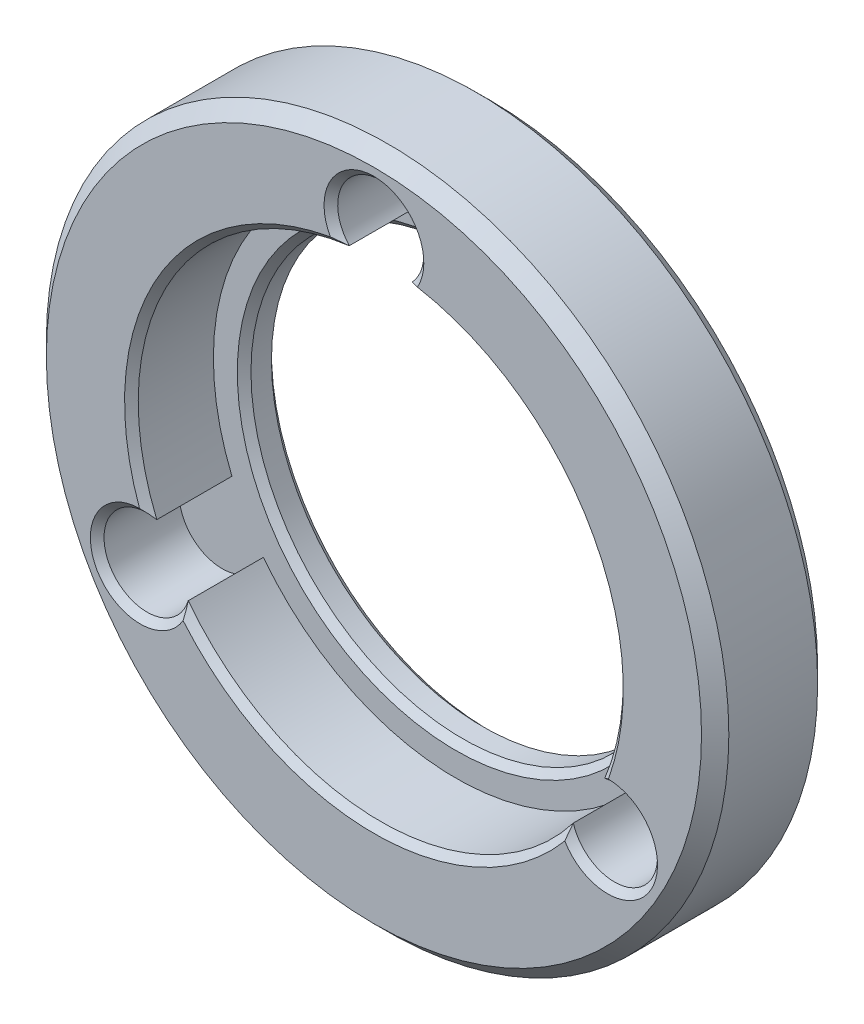
ISO-10303-21;
HEADER;
FILE_DESCRIPTION(('STEP AP214'),'2;1');
FILE_NAME('part.step','',(''),(''),'','','');
FILE_SCHEMA(('AUTOMOTIVE_DESIGN { 1 0 10303 214 1 1 1 1 }'));
ENDSEC;
DATA;
#1=APPLICATION_CONTEXT('core data for automotive mechanical design processes');
#2=APPLICATION_PROTOCOL_DEFINITION('international standard','automotive_design',2000,#1);
#3=PRODUCT_CONTEXT('',#1,'mechanical');
#4=PRODUCT('Part','Part','',(#3));
#5=PRODUCT_RELATED_PRODUCT_CATEGORY('part','',(#4));
#6=PRODUCT_DEFINITION_FORMATION('','',#4);
#7=PRODUCT_DEFINITION_CONTEXT('part definition',#1,'design');
#8=PRODUCT_DEFINITION('design','',#6,#7);
#9=PRODUCT_DEFINITION_SHAPE('','',#8);
#10=(LENGTH_UNIT() NAMED_UNIT(*) SI_UNIT(.MILLI.,.METRE.));
#11=(NAMED_UNIT(*) PLANE_ANGLE_UNIT() SI_UNIT($,.RADIAN.));
#12=(NAMED_UNIT(*) SI_UNIT($,.STERADIAN.) SOLID_ANGLE_UNIT());
#13=UNCERTAINTY_MEASURE_WITH_UNIT(LENGTH_MEASURE(1.E-05),#10,'distance_accuracy_value','');
#14=(GEOMETRIC_REPRESENTATION_CONTEXT(3) GLOBAL_UNCERTAINTY_ASSIGNED_CONTEXT((#13)) GLOBAL_UNIT_ASSIGNED_CONTEXT((#10,
#11,#12)) REPRESENTATION_CONTEXT('',''));
#15=CARTESIAN_POINT('',(0.,0.,0.));
#16=DIRECTION('',(0.,0.,1.));
#17=DIRECTION('',(1.,0.,0.));
#18=AXIS2_PLACEMENT_3D('',#15,#16,#17);
#19=CARTESIAN_POINT('',(-61.57257075142,7.13704868235254,27.7075634239852));
#20=DIRECTION('',(0.,0.,1.));
#21=DIRECTION('',(1.,0.,0.));
#22=AXIS2_PLACEMENT_3D('',#19,#20,#21);
#23=CYLINDRICAL_SURFACE('',#22,4.5085);
#24=DIRECTION('',(0.,0.,1.));
#25=VECTOR('',#24,1.);
#26=CARTESIAN_POINT('',(-65.1516811756143,4.39541763105786,28.4695634239852));
#27=LINE('',#26,#25);
#28=CARTESIAN_POINT('',(-65.1516811756143,4.39541763105786,27.7075634239852));
#29=VERTEX_POINT('',#28);
#30=CARTESIAN_POINT('',(-65.1516811756143,4.39541763105786,29.1045634239852));
#31=VERTEX_POINT('',#30);
#32=EDGE_CURVE('E100',#29,#31,#27,.T.);
#33=ORIENTED_EDGE('',*,*,#32,.T.);
#34=CARTESIAN_POINT('',(-61.57257075142,7.13704868235254,29.1045634239852));
#35=DIRECTION('',(0.,0.,1.));
#36=DIRECTION('',(1.,0.,0.));
#37=AXIS2_PLACEMENT_3D('',#34,#35,#36);
#38=CIRCLE('',#37,4.5085);
#39=CARTESIAN_POINT('',(-57.9934603272255,4.39541763105795,29.1045634239852));
#40=VERTEX_POINT('',#39);
#41=EDGE_CURVE('E149',#31,#40,#38,.T.);
#42=ORIENTED_EDGE('',*,*,#41,.T.);
#43=DIRECTION('',(0.,0.,1.));
#44=VECTOR('',#43,1.);
#45=CARTESIAN_POINT('',(-57.9934603272255,4.39541763105795,28.4695634239852));
#46=LINE('',#45,#44);
#47=CARTESIAN_POINT('',(-57.9934603272255,4.39541763105795,27.7075634239852));
#48=VERTEX_POINT('',#47);
#49=EDGE_CURVE('E140',#40,#48,#46,.F.);
#50=ORIENTED_EDGE('',*,*,#49,.T.);
#51=CARTESIAN_POINT('',(-61.57257075142,7.13704868235254,27.7075634239852));
#52=DIRECTION('',(0.,0.,1.));
#53=DIRECTION('',(1.,0.,0.));
#54=AXIS2_PLACEMENT_3D('',#51,#52,#53);
#55=CIRCLE('',#54,4.5085);
#56=EDGE_CURVE('E116',#29,#48,#55,.T.);
#57=ORIENTED_EDGE('',*,*,#56,.F.);
#58=EDGE_LOOP('',(#33,#42,#50,#57));
#59=FACE_BOUND('',#58,.T.);
#60=ADVANCED_FACE('F15',(#59),#23,.F.);
#61=DIRECTION('',(0.,0.,1.));
#62=VECTOR('',#61,1.);
#63=CARTESIAN_POINT('',(-57.4086934010974,5.40826365769772,28.4695634239852));
#64=LINE('',#63,#62);
#65=CARTESIAN_POINT('',(-57.4086934010974,5.40826365769772,27.7075634239852));
#66=VERTEX_POINT('',#65);
#67=CARTESIAN_POINT('',(-57.4086934010974,5.40826365769772,29.1045634239852));
#68=VERTEX_POINT('',#67);
#69=EDGE_CURVE('E136',#66,#68,#64,.T.);
#70=ORIENTED_EDGE('',*,*,#69,.T.);
#71=CARTESIAN_POINT('',(-61.57257075142,7.13704868235254,29.1045634239852));
#72=DIRECTION('',(0.,0.,1.));
#73=DIRECTION('',(1.,0.,0.));
#74=AXIS2_PLACEMENT_3D('',#71,#72,#73);
#75=CIRCLE('',#74,4.5085);
#76=CARTESIAN_POINT('',(-60.9878038252917,11.6074647583019,29.1045634239852));
#77=VERTEX_POINT('',#76);
#78=EDGE_CURVE('E274',#68,#77,#75,.T.);
#79=ORIENTED_EDGE('',*,*,#78,.T.);
#80=DIRECTION('',(0.,0.,1.));
#81=VECTOR('',#80,1.);
#82=CARTESIAN_POINT('',(-60.9878038252917,11.6074647583019,28.4695634239852));
#83=LINE('',#82,#81);
#84=CARTESIAN_POINT('',(-60.9878038252917,11.6074647583019,27.7075634239852));
#85=VERTEX_POINT('',#84);
#86=EDGE_CURVE('E130',#77,#85,#83,.F.);
#87=ORIENTED_EDGE('',*,*,#86,.T.);
#88=EDGE_CURVE('E118',#66,#85,#55,.T.);
#89=ORIENTED_EDGE('',*,*,#88,.F.);
#90=EDGE_LOOP('',(#70,#79,#87,#89));
#91=FACE_BOUND('',#90,.T.);
#92=ADVANCED_FACE('F207',(#91),#23,.F.);
#93=CARTESIAN_POINT('',(-61.57257075142,7.13704868235254,29.2315634239852));
#94=DIRECTION('',(0.,0.,-1.));
#95=DIRECTION('',(-1.,0.,0.));
#96=AXIS2_PLACEMENT_3D('',#93,#94,#95);
#97=CYLINDRICAL_SURFACE('',#96,3.937);
#98=CARTESIAN_POINT('',(-61.57257075142,7.13704868235254,27.5805634239852));
#99=DIRECTION('',(0.,0.,1.));
#100=DIRECTION('',(1.,0.,0.));
#101=AXIS2_PLACEMENT_3D('',#98,#99,#100);
#102=CIRCLE('',#101,3.937);
#103=CARTESIAN_POINT('',(-57.63557075142,7.13704868235254,27.5805634239852));
#104=VERTEX_POINT('',#103);
#105=EDGE_CURVE('E303',#104,#104,#102,.T.);
#106=ORIENTED_EDGE('',*,*,#105,.T.);
#107=EDGE_LOOP('',(#106));
#108=FACE_BOUND('',#107,.T.);
#109=CARTESIAN_POINT('',(-61.57257075142,7.13704868235254,27.1995634239852));
#110=DIRECTION('',(0.,0.,1.));
#111=DIRECTION('',(1.,0.,0.));
#112=AXIS2_PLACEMENT_3D('',#109,#110,#111);
#113=CIRCLE('',#112,3.937);
#114=CARTESIAN_POINT('',(-57.63557075142,7.13704868235254,27.1995634239852));
#115=VERTEX_POINT('',#114);
#116=EDGE_CURVE('E299',#115,#115,#113,.F.);
#117=ORIENTED_EDGE('',*,*,#116,.T.);
#118=EDGE_LOOP('',(#117));
#119=FACE_BOUND('',#118,.T.);
#120=ADVANCED_FACE('F211',(#108,#119),#97,.F.);
#121=CARTESIAN_POINT('',(-61.57257075142,7.13704868235254,29.2315634239852));
#122=DIRECTION('',(0.,0.,1.));
#123=DIRECTION('',(1.,0.,0.));
#124=AXIS2_PLACEMENT_3D('',#121,#122,#123);
#125=PLANE('',#124);
#126=CARTESIAN_POINT('',(-61.57257075142,7.13704868235254,29.2315634239852));
#127=DIRECTION('',(0.,0.,1.));
#128=DIRECTION('',(1.,0.,0.));
#129=AXIS2_PLACEMENT_3D('',#126,#127,#128);
#130=CIRCLE('',#129,4.63550000000001);
#131=CARTESIAN_POINT('',(-65.9300395524616,5.55580679764658,29.2315634239852));
#132=VERTEX_POINT('',#131);
#133=CARTESIAN_POINT('',(-62.3819095102576,11.7013483026057,29.2315634239852));
#134=VERTEX_POINT('',#133);
#135=EDGE_CURVE('E335',#132,#134,#130,.F.);
#136=ORIENTED_EDGE('',*,*,#135,.T.);
#137=CARTESIAN_POINT('',(-61.57257075142,12.1535486823525,29.2315634239852));
#138=DIRECTION('',(0.,0.,1.));
#139=DIRECTION('',(1.,0.,0.));
#140=AXIS2_PLACEMENT_3D('',#137,#138,#139);
#141=CIRCLE('',#140,0.927100000000008);
#142=CARTESIAN_POINT('',(-60.7632319925823,11.7013483026057,29.2315634239852));
#143=VERTEX_POINT('',#142);
#144=EDGE_CURVE('E284',#134,#143,#141,.F.);
#145=ORIENTED_EDGE('',*,*,#144,.T.);
#146=CARTESIAN_POINT('',(-61.57257075142,7.13704868235254,29.2315634239852));
#147=DIRECTION('',(0.,0.,1.));
#148=DIRECTION('',(1.,0.,0.));
#149=AXIS2_PLACEMENT_3D('',#146,#147,#148);
#150=CIRCLE('',#149,4.63550000000001);
#151=CARTESIAN_POINT('',(-57.2151019503783,5.55580679764663,29.2315634239852));
#152=VERTEX_POINT('',#151);
#153=EDGE_CURVE('E272',#143,#152,#150,.F.);
#154=ORIENTED_EDGE('',*,*,#153,.T.);
#155=CARTESIAN_POINT('',(-57.2281543133352,4.62879868235246,29.2315634239852));
#156=DIRECTION('',(0.,0.,1.));
#157=DIRECTION('',(1.,0.,0.));
#158=AXIS2_PLACEMENT_3D('',#155,#156,#157);
#159=CIRCLE('',#158,0.927100000000008);
#160=CARTESIAN_POINT('',(-58.0244407092158,4.15399094680524,29.2315634239852));
#161=VERTEX_POINT('',#160);
#162=EDGE_CURVE('E277',#152,#161,#159,.F.);
#163=ORIENTED_EDGE('',*,*,#162,.T.);
#164=CARTESIAN_POINT('',(-61.57257075142,7.13704868235254,29.2315634239852));
#165=DIRECTION('',(0.,0.,1.));
#166=DIRECTION('',(1.,0.,0.));
#167=AXIS2_PLACEMENT_3D('',#164,#165,#166);
#168=CIRCLE('',#167,4.63550000000001);
#169=CARTESIAN_POINT('',(-65.120700793624,4.15399094680517,29.2315634239852));
#170=VERTEX_POINT('',#169);
#171=EDGE_CURVE('E280',#161,#170,#168,.F.);
#172=ORIENTED_EDGE('',*,*,#171,.T.);
#173=CARTESIAN_POINT('',(-65.9169871895046,4.62879868235241,29.2315634239852));
#174=DIRECTION('',(0.,0.,1.));
#175=DIRECTION('',(1.,0.,0.));
#176=AXIS2_PLACEMENT_3D('',#173,#174,#175);
#177=CIRCLE('',#176,0.927100000000005);
#178=EDGE_CURVE('E168',#170,#132,#177,.F.);
#179=ORIENTED_EDGE('',*,*,#178,.T.);
#180=EDGE_LOOP('',(#136,#145,#154,#163,#172,#179));
#181=FACE_BOUND('',#180,.T.);
#182=CARTESIAN_POINT('',(-61.57257075142,7.13704868235254,29.2315634239852));
#183=DIRECTION('',(0.,0.,1.));
#184=DIRECTION('',(1.,0.,0.));
#185=AXIS2_PLACEMENT_3D('',#182,#183,#184);
#186=CIRCLE('',#185,6.08965);
#187=CARTESIAN_POINT('',(-55.48292075142,7.13704868235254,29.2315634239852));
#188=VERTEX_POINT('',#187);
#189=EDGE_CURVE('E323',#188,#188,#186,.T.);
#190=ORIENTED_EDGE('',*,*,#189,.T.);
#191=EDGE_LOOP('',(#190));
#192=FACE_BOUND('',#191,.T.);
#193=ADVANCED_FACE('F227',(#181,#192),#125,.T.);
#194=CARTESIAN_POINT('',(-61.57257075142,7.13704868235254,27.0725634239852));
#195=DIRECTION('',(0.,0.,1.));
#196=DIRECTION('',(1.,0.,0.));
#197=AXIS2_PLACEMENT_3D('',#194,#195,#196);
#198=PLANE('',#197);
#199=CARTESIAN_POINT('',(-61.57257075142,7.13704868235254,27.0725634239852));
#200=DIRECTION('',(0.,0.,1.));
#201=DIRECTION('',(1.,0.,0.));
#202=AXIS2_PLACEMENT_3D('',#199,#200,#201);
#203=CIRCLE('',#202,4.064);
#204=CARTESIAN_POINT('',(-57.50857075142,7.13704868235254,27.0725634239852));
#205=VERTEX_POINT('',#204);
#206=EDGE_CURVE('E10',#205,#205,#203,.T.);
#207=ORIENTED_EDGE('',*,*,#206,.T.);
#208=EDGE_LOOP('',(#207));
#209=FACE_BOUND('',#208,.T.);
#210=CARTESIAN_POINT('',(-61.57257075142,7.13704868235254,27.0725634239852));
#211=DIRECTION('',(0.,0.,1.));
#212=DIRECTION('',(1.,0.,0.));
#213=AXIS2_PLACEMENT_3D('',#210,#211,#212);
#214=CIRCLE('',#213,6.08965);
#215=CARTESIAN_POINT('',(-55.48292075142,7.13704868235254,27.0725634239852));
#216=VERTEX_POINT('',#215);
#217=EDGE_CURVE('E321',#216,#216,#214,.F.);
#218=ORIENTED_EDGE('',*,*,#217,.T.);
#219=EDGE_LOOP('',(#218));
#220=FACE_BOUND('',#219,.T.);
#221=ADVANCED_FACE('F222',(#209,#220),#198,.F.);
#222=CARTESIAN_POINT('',(-61.57257075142,7.13704868235254,29.2315634239852));
#223=DIRECTION('',(0.,0.,-1.));
#224=DIRECTION('',(-1.,0.,0.));
#225=AXIS2_PLACEMENT_3D('',#222,#223,#224);
#226=CYLINDRICAL_SURFACE('',#225,6.34365);
#227=CARTESIAN_POINT('',(-61.57257075142,7.13704868235254,27.3265634239852));
#228=DIRECTION('',(0.,0.,1.));
#229=DIRECTION('',(1.,0.,0.));
#230=AXIS2_PLACEMENT_3D('',#227,#228,#229);
#231=CIRCLE('',#230,6.34365);
#232=CARTESIAN_POINT('',(-55.22892075142,7.13704868235254,27.3265634239852));
#233=VERTEX_POINT('',#232);
#234=EDGE_CURVE('E123',#233,#233,#231,.T.);
#235=ORIENTED_EDGE('',*,*,#234,.T.);
#236=EDGE_LOOP('',(#235));
#237=FACE_BOUND('',#236,.T.);
#238=CARTESIAN_POINT('',(-61.57257075142,7.13704868235254,28.9775634239852));
#239=DIRECTION('',(0.,0.,1.));
#240=DIRECTION('',(1.,0.,0.));
#241=AXIS2_PLACEMENT_3D('',#238,#239,#240);
#242=CIRCLE('',#241,6.34365);
#243=CARTESIAN_POINT('',(-55.22892075142,7.13704868235254,28.9775634239852));
#244=VERTEX_POINT('',#243);
#245=EDGE_CURVE('E115',#244,#244,#242,.F.);
#246=ORIENTED_EDGE('',*,*,#245,.T.);
#247=EDGE_LOOP('',(#246));
#248=FACE_BOUND('',#247,.T.);
#249=ADVANCED_FACE('F216',(#237,#248),#226,.T.);
#250=DIRECTION('',(0.,0.,1.));
#251=VECTOR('',#250,1.);
#252=CARTESIAN_POINT('',(-62.1573376775482,11.6074647583019,28.4695634239852));
#253=LINE('',#252,#251);
#254=CARTESIAN_POINT('',(-62.1573376775482,11.6074647583019,27.7075634239852));
#255=VERTEX_POINT('',#254);
#256=CARTESIAN_POINT('',(-62.1573376775482,11.6074647583019,29.1045634239852));
#257=VERTEX_POINT('',#256);
#258=EDGE_CURVE('E127',#255,#257,#253,.T.);
#259=ORIENTED_EDGE('',*,*,#258,.T.);
#260=CARTESIAN_POINT('',(-61.57257075142,7.13704868235254,29.1045634239852));
#261=DIRECTION('',(0.,0.,1.));
#262=DIRECTION('',(1.,0.,0.));
#263=AXIS2_PLACEMENT_3D('',#260,#261,#262);
#264=CIRCLE('',#263,4.5085);
#265=CARTESIAN_POINT('',(-65.7364481017425,5.40826365769769,29.1045634239852));
#266=VERTEX_POINT('',#265);
#267=EDGE_CURVE('E38',#257,#266,#264,.T.);
#268=ORIENTED_EDGE('',*,*,#267,.T.);
#269=DIRECTION('',(0.,0.,1.));
#270=VECTOR('',#269,1.);
#271=CARTESIAN_POINT('',(-65.7364481017425,5.40826365769769,28.4695634239852));
#272=LINE('',#271,#270);
#273=CARTESIAN_POINT('',(-65.7364481017425,5.40826365769769,27.7075634239852));
#274=VERTEX_POINT('',#273);
#275=EDGE_CURVE('E94',#266,#274,#272,.F.);
#276=ORIENTED_EDGE('',*,*,#275,.T.);
#277=EDGE_CURVE('E98',#255,#274,#55,.T.);
#278=ORIENTED_EDGE('',*,*,#277,.F.);
#279=EDGE_LOOP('',(#259,#268,#276,#278));
#280=FACE_BOUND('',#279,.T.);
#281=ADVANCED_FACE('F96',(#280),#23,.F.);
#282=CARTESIAN_POINT('',(-61.57257075142,7.13704868235254,27.7075634239852));
#283=DIRECTION('',(0.,0.,1.));
#284=DIRECTION('',(1.,0.,0.));
#285=AXIS2_PLACEMENT_3D('',#282,#283,#284);
#286=PLANE('',#285);
#287=CARTESIAN_POINT('',(-61.57257075142,7.13704868235254,27.7075634239852));
#288=DIRECTION('',(0.,0.,1.));
#289=DIRECTION('',(1.,0.,0.));
#290=AXIS2_PLACEMENT_3D('',#287,#288,#289);
#291=CIRCLE('',#290,4.064);
#292=CARTESIAN_POINT('',(-57.50857075142,7.13704868235254,27.7075634239852));
#293=VERTEX_POINT('',#292);
#294=EDGE_CURVE('E30',#293,#293,#291,.F.);
#295=ORIENTED_EDGE('',*,*,#294,.T.);
#296=EDGE_LOOP('',(#295));
#297=FACE_BOUND('',#296,.T.);
#298=ORIENTED_EDGE('',*,*,#277,.T.);
#299=CARTESIAN_POINT('',(-65.9169871895046,4.62879868235241,27.7075634239852));
#300=DIRECTION('',(0.,0.,1.));
#301=DIRECTION('',(1.,0.,0.));
#302=AXIS2_PLACEMENT_3D('',#299,#300,#301);
#303=CIRCLE('',#302,0.800099999999997);
#304=EDGE_CURVE('E101',#274,#29,#303,.T.);
#305=ORIENTED_EDGE('',*,*,#304,.T.);
#306=ORIENTED_EDGE('',*,*,#56,.T.);
#307=CARTESIAN_POINT('',(-57.2281543133352,4.62879868235246,27.7075634239852));
#308=DIRECTION('',(0.,0.,1.));
#309=DIRECTION('',(1.,0.,0.));
#310=AXIS2_PLACEMENT_3D('',#307,#308,#309);
#311=CIRCLE('',#310,0.8001);
#312=EDGE_CURVE('E143',#48,#66,#311,.T.);
#313=ORIENTED_EDGE('',*,*,#312,.T.);
#314=ORIENTED_EDGE('',*,*,#88,.T.);
#315=CARTESIAN_POINT('',(-61.57257075142,12.1535486823525,27.7075634239852));
#316=DIRECTION('',(0.,0.,1.));
#317=DIRECTION('',(1.,0.,0.));
#318=AXIS2_PLACEMENT_3D('',#315,#316,#317);
#319=CIRCLE('',#318,0.8001);
#320=EDGE_CURVE('E112',#85,#255,#319,.T.);
#321=ORIENTED_EDGE('',*,*,#320,.T.);
#322=EDGE_LOOP('',(#298,#305,#306,#313,#314,#321));
#323=FACE_BOUND('',#322,.T.);
#324=ADVANCED_FACE('F109',(#297,#323),#286,.T.);
#325=CARTESIAN_POINT('',(-61.57257075142,12.1535486823525,27.7075634239852));
#326=DIRECTION('',(0.,0.,1.));
#327=DIRECTION('',(1.,0.,0.));
#328=AXIS2_PLACEMENT_3D('',#325,#326,#327);
#329=CYLINDRICAL_SURFACE('',#328,0.8001);
#330=ORIENTED_EDGE('',*,*,#86,.F.);
#331=CARTESIAN_POINT('',(-61.57257075142,12.1535486823525,29.1045634239852));
#332=DIRECTION('',(0.,0.,1.));
#333=DIRECTION('',(1.,0.,0.));
#334=AXIS2_PLACEMENT_3D('',#331,#332,#333);
#335=CIRCLE('',#334,0.8001);
#336=EDGE_CURVE('E328',#77,#257,#335,.T.);
#337=ORIENTED_EDGE('',*,*,#336,.T.);
#338=ORIENTED_EDGE('',*,*,#258,.F.);
#339=ORIENTED_EDGE('',*,*,#320,.F.);
#340=EDGE_LOOP('',(#330,#337,#338,#339));
#341=FACE_BOUND('',#340,.T.);
#342=ADVANCED_FACE('F220',(#341),#329,.F.);
#343=CARTESIAN_POINT('',(-57.2281543133352,4.62879868235246,27.7075634239852));
#344=DIRECTION('',(0.,0.,1.));
#345=DIRECTION('',(1.,0.,0.));
#346=AXIS2_PLACEMENT_3D('',#343,#344,#345);
#347=CYLINDRICAL_SURFACE('',#346,0.8001);
#348=ORIENTED_EDGE('',*,*,#49,.F.);
#349=CARTESIAN_POINT('',(-57.2281543133352,4.62879868235246,29.1045634239852));
#350=DIRECTION('',(0.,0.,1.));
#351=DIRECTION('',(1.,0.,0.));
#352=AXIS2_PLACEMENT_3D('',#349,#350,#351);
#353=CIRCLE('',#352,0.8001);
#354=EDGE_CURVE('E162',#40,#68,#353,.T.);
#355=ORIENTED_EDGE('',*,*,#354,.T.);
#356=ORIENTED_EDGE('',*,*,#69,.F.);
#357=ORIENTED_EDGE('',*,*,#312,.F.);
#358=EDGE_LOOP('',(#348,#355,#356,#357));
#359=FACE_BOUND('',#358,.T.);
#360=ADVANCED_FACE('F349',(#359),#347,.F.);
#361=CARTESIAN_POINT('',(-65.9169871895046,4.62879868235241,27.7075634239852));
#362=DIRECTION('',(0.,0.,1.));
#363=DIRECTION('',(1.,0.,0.));
#364=AXIS2_PLACEMENT_3D('',#361,#362,#363);
#365=CYLINDRICAL_SURFACE('',#364,0.800099999999997);
#366=ORIENTED_EDGE('',*,*,#275,.F.);
#367=CARTESIAN_POINT('',(-65.9169871895046,4.62879868235241,29.1045634239852));
#368=DIRECTION('',(0.,0.,1.));
#369=DIRECTION('',(1.,0.,0.));
#370=AXIS2_PLACEMENT_3D('',#367,#368,#369);
#371=CIRCLE('',#370,0.800099999999997);
#372=EDGE_CURVE('E45',#266,#31,#371,.T.);
#373=ORIENTED_EDGE('',*,*,#372,.T.);
#374=ORIENTED_EDGE('',*,*,#32,.F.);
#375=ORIENTED_EDGE('',*,*,#304,.F.);
#376=EDGE_LOOP('',(#366,#373,#374,#375));
#377=FACE_BOUND('',#376,.T.);
#378=ADVANCED_FACE('F103',(#377),#365,.F.);
#379=CARTESIAN_POINT('',(-61.57257075142,7.13704868235254,27.3265634239852));
#380=DIRECTION('',(0.,0.,1.));
#381=DIRECTION('',(1.,0.,0.));
#382=AXIS2_PLACEMENT_3D('',#379,#380,#381);
#383=CONICAL_SURFACE('',#382,6.34365,0.785398163397452);
#384=ORIENTED_EDGE('',*,*,#217,.F.);
#385=EDGE_LOOP('',(#384));
#386=FACE_BOUND('',#385,.T.);
#387=ORIENTED_EDGE('',*,*,#234,.F.);
#388=EDGE_LOOP('',(#387));
#389=FACE_BOUND('',#388,.T.);
#390=ADVANCED_FACE('F234',(#386,#389),#383,.T.);
#391=CARTESIAN_POINT('',(-61.57257075142,7.13704868235254,29.2315634239852));
#392=DIRECTION('',(0.,0.,-1.));
#393=DIRECTION('',(-1.,0.,0.));
#394=AXIS2_PLACEMENT_3D('',#391,#392,#393);
#395=CONICAL_SURFACE('',#394,6.08965,0.785398163397448);
#396=ORIENTED_EDGE('',*,*,#245,.F.);
#397=EDGE_LOOP('',(#396));
#398=FACE_BOUND('',#397,.T.);
#399=ORIENTED_EDGE('',*,*,#189,.F.);
#400=EDGE_LOOP('',(#399));
#401=FACE_BOUND('',#400,.T.);
#402=ADVANCED_FACE('F189',(#398,#401),#395,.T.);
#403=CARTESIAN_POINT('',(-61.57257075142,7.13704868235254,29.1045634239852));
#404=DIRECTION('',(0.,0.,1.));
#405=DIRECTION('',(1.,0.,0.));
#406=AXIS2_PLACEMENT_3D('',#403,#404,#405);
#407=CONICAL_SURFACE('',#406,4.5085,0.785398163397448);
#408=CARTESIAN_POINT('',(-65.120700793624,4.15399094680517,29.2315634239852));
#409=CARTESIAN_POINT('',(-65.1222991170455,4.1737411995317,29.2200773942999));
#410=CARTESIAN_POINT('',(-65.1241110594603,4.19358515591489,29.2087782434015));
#411=CARTESIAN_POINT('',(-65.1282080432545,4.23344130881835,29.18662038827));
#412=CARTESIAN_POINT('',(-65.130492586387,4.25345330703064,29.1757612344662));
#413=CARTESIAN_POINT('',(-65.1355843234212,4.29367205647997,29.1545234898304));
#414=CARTESIAN_POINT('',(-65.1383916277814,4.31387884801924,29.1441450011418));
#415=CARTESIAN_POINT('',(-65.1445869470015,4.35449934620696,29.1239283794949));
#416=CARTESIAN_POINT('',(-65.1479755689758,4.37491324797091,29.1140908258057));
#417=CARTESIAN_POINT('',(-65.1516811756143,4.39541763105786,29.1045634239852));
#418=B_SPLINE_CURVE_WITH_KNOTS('',3,(#408,#409,#410,#411,#412,#413,#414,#415,#416,#417),
.UNSPECIFIED.,.F.,.F.,(4,2,2,2,4),(0.,0.0687104710508369,0.137348868822198,0.20600178624261,
0.27472684458147),.UNSPECIFIED.);
#419=EDGE_CURVE('E157',#170,#31,#418,.T.);
#420=ORIENTED_EDGE('',*,*,#419,.F.);
#421=ORIENTED_EDGE('',*,*,#171,.F.);
#422=CARTESIAN_POINT('',(-58.0244407092158,4.15399094680524,29.2315634239852));
#423=CARTESIAN_POINT('',(-58.0228423857944,4.17374119953177,29.2200773942999));
#424=CARTESIAN_POINT('',(-58.0210304433795,4.19358515591496,29.2087782434015));
#425=CARTESIAN_POINT('',(-58.0169334595853,4.23344130881842,29.18662038827));
#426=CARTESIAN_POINT('',(-58.0146489164529,4.25345330703071,29.1757612344663));
#427=CARTESIAN_POINT('',(-58.0095571794186,4.29367205648005,29.1545234898305));
#428=CARTESIAN_POINT('',(-58.0067498750584,4.31387884801932,29.1441450011418));
#429=CARTESIAN_POINT('',(-58.0005545558384,4.35449934620704,29.1239283794949));
#430=CARTESIAN_POINT('',(-57.9971659338641,4.37491324797099,29.1140908258057));
#431=CARTESIAN_POINT('',(-57.9934603272255,4.39541763105795,29.1045634239852));
#432=B_SPLINE_CURVE_WITH_KNOTS('',3,(#422,#423,#424,#425,#426,#427,#428,#429,#430,#431),
.UNSPECIFIED.,.F.,.F.,(4,2,2,2,4),(0.,0.0687104710508397,0.137348868822203,0.206001786242617,
0.274726844581483),.UNSPECIFIED.);
#433=EDGE_CURVE('E19',#40,#161,#432,.F.);
#434=ORIENTED_EDGE('',*,*,#433,.F.);
#435=ORIENTED_EDGE('',*,*,#41,.F.);
#436=EDGE_LOOP('',(#420,#421,#434,#435));
#437=FACE_BOUND('',#436,.T.);
#438=ADVANCED_FACE('F155',(#437),#407,.F.);
#439=CARTESIAN_POINT('',(-57.2281543133352,4.62879868235246,29.1045634239852));
#440=DIRECTION('',(0.,0.,1.));
#441=DIRECTION('',(1.,0.,0.));
#442=AXIS2_PLACEMENT_3D('',#439,#440,#441);
#443=CONICAL_SURFACE('',#442,0.8001,0.785398163397448);
#444=ORIENTED_EDGE('',*,*,#433,.T.);
#445=ORIENTED_EDGE('',*,*,#162,.F.);
#446=CARTESIAN_POINT('',(-57.2151019503783,5.55580679764663,29.2315634239852));
#447=CARTESIAN_POINT('',(-57.2314070092599,5.54454748259689,29.2200773942999));
#448=CARTESIAN_POINT('',(-57.2476864083919,5.53305631624386,29.2087782434015));
#449=CARTESIAN_POINT('',(-57.2801543574063,5.50958014774748,29.18662038827));
#450=CARTESIAN_POINT('',(-57.2963429846724,5.49759567625257,29.1757612344663));
#451=CARTESIAN_POINT('',(-57.3286275748868,5.47307672790685,29.1545234898305));
#452=CARTESIAN_POINT('',(-57.3447235175087,5.46054213524515,29.1441450011418));
#453=CARTESIAN_POINT('',(-57.3768042412437,5.43486658232217,29.1239283794949));
#454=CARTESIAN_POINT('',(-57.3927888877744,5.42172499872662,29.1140908258057));
#455=CARTESIAN_POINT('',(-57.4086934010974,5.40826365769772,29.1045634239852));
#456=B_SPLINE_CURVE_WITH_KNOTS('',3,(#446,#447,#448,#449,#450,#451,#452,#453,#454,#455),
.UNSPECIFIED.,.F.,.F.,(4,2,2,2,4),(0.,0.0687104710508424,0.137348868822202,0.206001786242614,
0.274726844581483),.UNSPECIFIED.);
#457=EDGE_CURVE('E170',#68,#152,#456,.F.);
#458=ORIENTED_EDGE('',*,*,#457,.F.);
#459=ORIENTED_EDGE('',*,*,#354,.F.);
#460=EDGE_LOOP('',(#444,#445,#458,#459));
#461=FACE_BOUND('',#460,.T.);
#462=ADVANCED_FACE('F188',(#461),#443,.F.);
#463=CARTESIAN_POINT('',(-65.9169871895046,4.62879868235241,29.1045634239852));
#464=DIRECTION('',(0.,0.,1.));
#465=DIRECTION('',(1.,0.,0.));
#466=AXIS2_PLACEMENT_3D('',#463,#464,#465);
#467=CONICAL_SURFACE('',#466,0.800099999999997,0.785398163397446);
#468=ORIENTED_EDGE('',*,*,#419,.T.);
#469=ORIENTED_EDGE('',*,*,#372,.F.);
#470=CARTESIAN_POINT('',(-65.9300395524616,5.55580679764658,29.2315634239852));
#471=CARTESIAN_POINT('',(-65.91373449358,5.54454748259684,29.2200773942999));
#472=CARTESIAN_POINT('',(-65.897455094448,5.53305631624382,29.2087782434015));
#473=CARTESIAN_POINT('',(-65.8649871454336,5.50958014774743,29.18662038827));
#474=CARTESIAN_POINT('',(-65.8487985181675,5.49759567625252,29.1757612344663));
#475=CARTESIAN_POINT('',(-65.8165139279531,5.47307672790681,29.1545234898304));
#476=CARTESIAN_POINT('',(-65.8004179853312,5.4605421352451,29.1441450011418));
#477=CARTESIAN_POINT('',(-65.7683372615962,5.43486658232213,29.1239283794949));
#478=CARTESIAN_POINT('',(-65.7523526150655,5.42172499872658,29.1140908258057));
#479=CARTESIAN_POINT('',(-65.7364481017425,5.40826365769769,29.1045634239852));
#480=B_SPLINE_CURVE_WITH_KNOTS('',3,(#470,#471,#472,#473,#474,#475,#476,#477,#478,#479),
.UNSPECIFIED.,.F.,.F.,(4,2,2,2,4),(0.,0.068710471050831,0.137348868822206,0.206001786242617,
0.274726844581473),.UNSPECIFIED.);
#481=EDGE_CURVE('E174',#132,#266,#480,.T.);
#482=ORIENTED_EDGE('',*,*,#481,.F.);
#483=ORIENTED_EDGE('',*,*,#178,.F.);
#484=EDGE_LOOP('',(#468,#469,#482,#483));
#485=FACE_BOUND('',#484,.T.);
#486=ADVANCED_FACE('F165',(#485),#467,.F.);
#487=CARTESIAN_POINT('',(-61.57257075142,7.13704868235254,29.1045634239852));
#488=DIRECTION('',(0.,0.,1.));
#489=DIRECTION('',(1.,0.,0.));
#490=AXIS2_PLACEMENT_3D('',#487,#488,#489);
#491=CONICAL_SURFACE('',#490,4.5085,0.785398163397448);
#492=ORIENTED_EDGE('',*,*,#457,.T.);
#493=ORIENTED_EDGE('',*,*,#153,.F.);
#494=CARTESIAN_POINT('',(-60.7632319925823,11.7013483026057,29.2315634239852));
#495=CARTESIAN_POINT('',(-60.7811353748854,11.6928573649289,29.2200773942999));
#496=CARTESIAN_POINT('',(-60.7992267164323,11.6845045748988,29.2087782434015));
#497=CARTESIAN_POINT('',(-60.8357916492408,11.6681245904917,29.18662038827));
#498=CARTESIAN_POINT('',(-60.8542648196394,11.6600970637743,29.1757612344663));
#499=CARTESIAN_POINT('',(-60.8916411468881,11.6443972626707,29.1545234898305));
#500=CARTESIAN_POINT('',(-60.9105443938702,11.6367250637931,29.1441450011418));
#501=CARTESIAN_POINT('',(-60.9488204368251,11.6217801185284,29.1239283794949));
#502=CARTESIAN_POINT('',(-60.9681937053302,11.61450780036,29.1140908258057));
#503=CARTESIAN_POINT('',(-60.9878038252917,11.6074647583019,29.1045634239852));
#504=B_SPLINE_CURVE_WITH_KNOTS('',3,(#494,#495,#496,#497,#498,#499,#500,#501,#502,#503),
.UNSPECIFIED.,.F.,.F.,(4,2,2,2,4),(0.,0.0687104710508302,0.137348868822183,0.206001786242588,
0.274726844581443),.UNSPECIFIED.);
#505=EDGE_CURVE('E257',#77,#143,#504,.F.);
#506=ORIENTED_EDGE('',*,*,#505,.F.);
#507=ORIENTED_EDGE('',*,*,#78,.F.);
#508=EDGE_LOOP('',(#492,#493,#506,#507));
#509=FACE_BOUND('',#508,.T.);
#510=ADVANCED_FACE('F243',(#509),#491,.F.);
#511=CARTESIAN_POINT('',(-61.57257075142,7.13704868235254,29.1045634239852));
#512=DIRECTION('',(0.,0.,1.));
#513=DIRECTION('',(1.,0.,0.));
#514=AXIS2_PLACEMENT_3D('',#511,#512,#513);
#515=CONICAL_SURFACE('',#514,4.5085,0.785398163397448);
#516=ORIENTED_EDGE('',*,*,#481,.T.);
#517=ORIENTED_EDGE('',*,*,#267,.F.);
#518=CARTESIAN_POINT('',(-62.1573376775482,11.6074647583019,29.1045634239852));
#519=CARTESIAN_POINT('',(-62.1769477975097,11.61450780036,29.1140908258057));
#520=CARTESIAN_POINT('',(-62.1963210660148,11.6217801185284,29.1239283794949));
#521=CARTESIAN_POINT('',(-62.2345971089698,11.6367250637931,29.1441450011418));
#522=CARTESIAN_POINT('',(-62.2535003559518,11.6443972626707,29.1545234898305));
#523=CARTESIAN_POINT('',(-62.2908766832005,11.6600970637743,29.1757612344663));
#524=CARTESIAN_POINT('',(-62.3093498535991,11.6681245904917,29.18662038827));
#525=CARTESIAN_POINT('',(-62.3459147864077,11.6845045748988,29.2087782434015));
#526=CARTESIAN_POINT('',(-62.3640061279545,11.6928573649289,29.2200773942999));
#527=CARTESIAN_POINT('',(-62.3819095102576,11.7013483026057,29.2315634239852));
#528=B_SPLINE_CURVE_WITH_KNOTS('',3,(#518,#519,#520,#521,#522,#523,#524,#525,#526,#527),
.UNSPECIFIED.,.F.,.F.,(4,2,2,2,4),(0.,0.0687250583388628,0.137377975759259,0.206016373530612,
0.274726844581443),.UNSPECIFIED.);
#529=EDGE_CURVE('E248',#134,#257,#528,.F.);
#530=ORIENTED_EDGE('',*,*,#529,.F.);
#531=ORIENTED_EDGE('',*,*,#135,.F.);
#532=EDGE_LOOP('',(#516,#517,#530,#531));
#533=FACE_BOUND('',#532,.T.);
#534=ADVANCED_FACE('F201',(#533),#515,.F.);
#535=CARTESIAN_POINT('',(-61.57257075142,12.1535486823525,29.1045634239852));
#536=DIRECTION('',(0.,0.,1.));
#537=DIRECTION('',(1.,0.,0.));
#538=AXIS2_PLACEMENT_3D('',#535,#536,#537);
#539=CONICAL_SURFACE('',#538,0.8001,0.785398163397447);
#540=ORIENTED_EDGE('',*,*,#505,.T.);
#541=ORIENTED_EDGE('',*,*,#144,.F.);
#542=ORIENTED_EDGE('',*,*,#529,.T.);
#543=ORIENTED_EDGE('',*,*,#336,.F.);
#544=EDGE_LOOP('',(#540,#541,#542,#543));
#545=FACE_BOUND('',#544,.T.);
#546=ADVANCED_FACE('F194',(#545),#539,.F.);
#547=CARTESIAN_POINT('',(-61.57257075142,7.13704868235254,27.5805634239852));
#548=DIRECTION('',(0.,0.,1.));
#549=DIRECTION('',(1.,0.,0.));
#550=AXIS2_PLACEMENT_3D('',#547,#548,#549);
#551=CONICAL_SURFACE('',#550,3.937,0.785398163397452);
#552=ORIENTED_EDGE('',*,*,#294,.F.);
#553=EDGE_LOOP('',(#552));
#554=FACE_BOUND('',#553,.T.);
#555=ORIENTED_EDGE('',*,*,#105,.F.);
#556=EDGE_LOOP('',(#555));
#557=FACE_BOUND('',#556,.T.);
#558=ADVANCED_FACE('F191',(#554,#557),#551,.F.);
#559=CARTESIAN_POINT('',(-61.57257075142,7.13704868235254,27.0725634239852));
#560=DIRECTION('',(0.,0.,-1.));
#561=DIRECTION('',(-1.,0.,0.));
#562=AXIS2_PLACEMENT_3D('',#559,#560,#561);
#563=CONICAL_SURFACE('',#562,4.064,0.785398163397438);
#564=ORIENTED_EDGE('',*,*,#116,.F.);
#565=EDGE_LOOP('',(#564));
#566=FACE_BOUND('',#565,.T.);
#567=ORIENTED_EDGE('',*,*,#206,.F.);
#568=EDGE_LOOP('',(#567));
#569=FACE_BOUND('',#568,.T.);
#570=ADVANCED_FACE('F17',(#566,#569),#563,.F.);
#571=CLOSED_SHELL('',(#60,#92,#120,#193,#221,#249,#281,#324,#342,#360,#378,#390,#402,#438,#462,
#486,#510,#534,#546,#558,#570));
#572=MANIFOLD_SOLID_BREP('B1',#571);
#573=ADVANCED_BREP_SHAPE_REPRESENTATION('',(#18,#572),#14);
#574=SHAPE_DEFINITION_REPRESENTATION(#9,#573);
ENDSEC;
END-ISO-10303-21;
